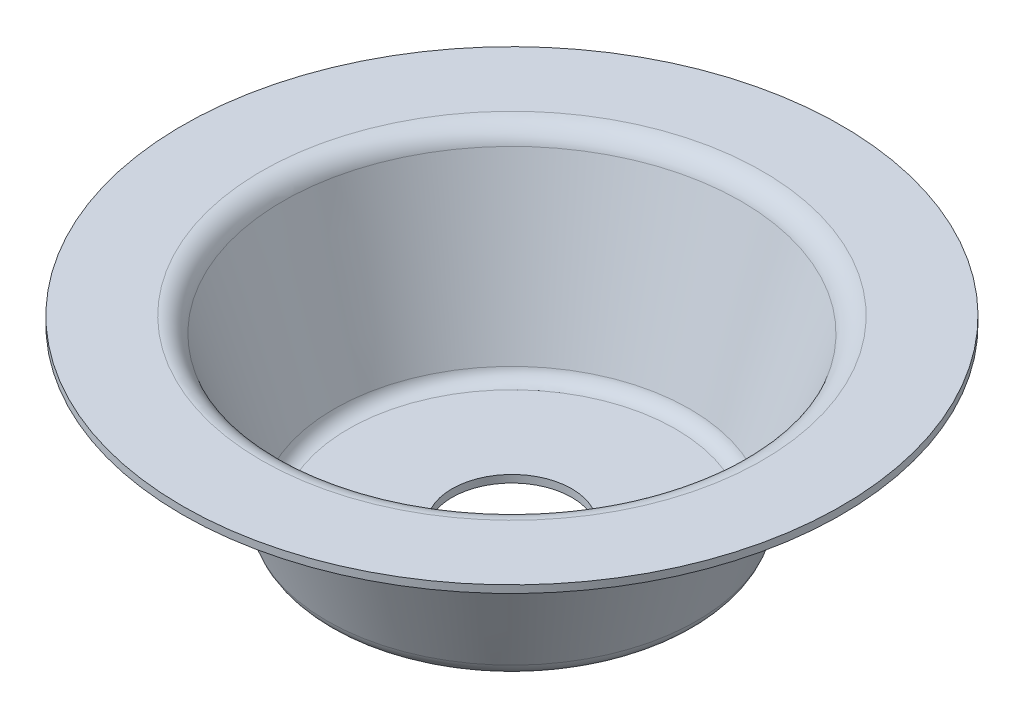
ISO-10303-21;
HEADER;
FILE_DESCRIPTION(('STEP AP214'),'2;1');
FILE_NAME('part.step','',(''),(''),'','','');
FILE_SCHEMA(('AUTOMOTIVE_DESIGN { 1 0 10303 214 1 1 1 1 }'));
ENDSEC;
DATA;
#1=APPLICATION_CONTEXT('core data for automotive mechanical design processes');
#2=APPLICATION_PROTOCOL_DEFINITION('international standard','automotive_design',2000,#1);
#3=PRODUCT_CONTEXT('',#1,'mechanical');
#4=PRODUCT('Part','Part','',(#3));
#5=PRODUCT_RELATED_PRODUCT_CATEGORY('part','',(#4));
#6=PRODUCT_DEFINITION_FORMATION('','',#4);
#7=PRODUCT_DEFINITION_CONTEXT('part definition',#1,'design');
#8=PRODUCT_DEFINITION('design','',#6,#7);
#9=PRODUCT_DEFINITION_SHAPE('','',#8);
#10=(LENGTH_UNIT() NAMED_UNIT(*) SI_UNIT(.MILLI.,.METRE.));
#11=(NAMED_UNIT(*) PLANE_ANGLE_UNIT() SI_UNIT($,.RADIAN.));
#12=(NAMED_UNIT(*) SI_UNIT($,.STERADIAN.) SOLID_ANGLE_UNIT());
#13=UNCERTAINTY_MEASURE_WITH_UNIT(LENGTH_MEASURE(1.E-05),#10,'distance_accuracy_value','');
#14=(GEOMETRIC_REPRESENTATION_CONTEXT(3) GLOBAL_UNCERTAINTY_ASSIGNED_CONTEXT((#13)) GLOBAL_UNIT_ASSIGNED_CONTEXT((#10,
#11,#12)) REPRESENTATION_CONTEXT('',''));
#15=CARTESIAN_POINT('',(0.,0.,0.));
#16=DIRECTION('',(0.,0.,1.));
#17=DIRECTION('',(1.,0.,0.));
#18=AXIS2_PLACEMENT_3D('',#15,#16,#17);
#19=CARTESIAN_POINT('',(-53.0884105236782,39.6875,0.));
#20=DIRECTION('',(0.,1.,0.));
#21=DIRECTION('',(0.,0.,1.));
#22=AXIS2_PLACEMENT_3D('',#19,#20,#21);
#23=PLANE('',#22);
#24=CARTESIAN_POINT('',(0.,39.6875,0.));
#25=DIRECTION('',(0.,1.,0.));
#26=DIRECTION('',(0.,0.,1.));
#27=AXIS2_PLACEMENT_3D('',#24,#25,#26);
#28=CIRCLE('',#27,69.85);
#29=CARTESIAN_POINT('',(0.,39.6875,69.85));
#30=VERTEX_POINT('',#29);
#31=EDGE_CURVE('E10',#30,#30,#28,.T.);
#32=ORIENTED_EDGE('',*,*,#31,.T.);
#33=EDGE_LOOP('',(#32));
#34=FACE_BOUND('',#33,.T.);
#35=CARTESIAN_POINT('',(0.,39.6875,0.));
#36=DIRECTION('',(0.,1.,0.));
#37=DIRECTION('',(0.,0.,1.));
#38=AXIS2_PLACEMENT_3D('',#35,#36,#37);
#39=CIRCLE('',#38,53.0884105236782);
#40=CARTESIAN_POINT('',(0.,39.6875,53.0884105236782));
#41=VERTEX_POINT('',#40);
#42=EDGE_CURVE('E66',#41,#41,#39,.T.);
#43=ORIENTED_EDGE('',*,*,#42,.F.);
#44=EDGE_LOOP('',(#43));
#45=FACE_BOUND('',#44,.T.);
#46=ADVANCED_FACE('F32',(#34,#45),#23,.T.);
#47=CARTESIAN_POINT('',(0.,40.5012674271229,0.));
#48=DIRECTION('',(0.,1.,0.));
#49=DIRECTION('',(0.,0.,1.));
#50=AXIS2_PLACEMENT_3D('',#47,#48,#49);
#51=CYLINDRICAL_SURFACE('',#50,69.85);
#52=ORIENTED_EDGE('',*,*,#31,.F.);
#53=EDGE_LOOP('',(#52));
#54=FACE_BOUND('',#53,.T.);
#55=CARTESIAN_POINT('',(0.,38.1,0.));
#56=DIRECTION('',(0.,1.,0.));
#57=DIRECTION('',(0.,0.,1.));
#58=AXIS2_PLACEMENT_3D('',#55,#56,#57);
#59=CIRCLE('',#58,69.85);
#60=CARTESIAN_POINT('',(0.,38.1,69.85));
#61=VERTEX_POINT('',#60);
#62=EDGE_CURVE('E39',#61,#61,#59,.T.);
#63=ORIENTED_EDGE('',*,*,#62,.T.);
#64=EDGE_LOOP('',(#63));
#65=FACE_BOUND('',#64,.T.);
#66=ADVANCED_FACE('F97',(#54,#65),#51,.T.);
#67=CARTESIAN_POINT('',(-53.0884105236782,38.1,0.));
#68=DIRECTION('',(0.,1.,0.));
#69=DIRECTION('',(0.,0.,1.));
#70=AXIS2_PLACEMENT_3D('',#67,#68,#69);
#71=PLANE('',#70);
#72=ORIENTED_EDGE('',*,*,#62,.F.);
#73=EDGE_LOOP('',(#72));
#74=FACE_BOUND('',#73,.T.);
#75=CARTESIAN_POINT('',(0.,38.1,0.));
#76=DIRECTION('',(0.,1.,0.));
#77=DIRECTION('',(0.,0.,1.));
#78=AXIS2_PLACEMENT_3D('',#75,#76,#77);
#79=CIRCLE('',#78,53.0884105236782);
#80=CARTESIAN_POINT('',(0.,38.1,53.0884105236782));
#81=VERTEX_POINT('',#80);
#82=EDGE_CURVE('E43',#81,#81,#79,.T.);
#83=ORIENTED_EDGE('',*,*,#82,.T.);
#84=EDGE_LOOP('',(#83));
#85=FACE_BOUND('',#84,.T.);
#86=ADVANCED_FACE('F101',(#74,#85),#71,.F.);
#87=CARTESIAN_POINT('',(0.,34.925,0.));
#88=DIRECTION('',(0.,1.,0.));
#89=DIRECTION('',(0.,0.,1.));
#90=AXIS2_PLACEMENT_3D('',#87,#88,#89);
#91=TOROIDAL_SURFACE('',#90,53.0884105236782,3.175);
#92=ORIENTED_EDGE('',*,*,#82,.F.);
#93=EDGE_LOOP('',(#92));
#94=FACE_BOUND('',#93,.T.);
#95=CARTESIAN_POINT('',(0.,35.9290231571034,0.));
#96=DIRECTION('',(0.,1.,0.));
#97=DIRECTION('',(0.,0.,1.));
#98=AXIS2_PLACEMENT_3D('',#95,#96,#97);
#99=CIRCLE('',#98,50.0763410523678);
#100=CARTESIAN_POINT('',(0.,35.9290231571034,50.0763410523678));
#101=VERTEX_POINT('',#100);
#102=EDGE_CURVE('E48',#101,#101,#99,.T.);
#103=ORIENTED_EDGE('',*,*,#102,.T.);
#104=EDGE_LOOP('',(#103));
#105=FACE_BOUND('',#104,.T.);
#106=ADVANCED_FACE('F167',(#94,#105),#91,.F.);
#107=CARTESIAN_POINT('',(0.,3.2564652643448,0.));
#108=DIRECTION('',(0.,1.,0.));
#109=DIRECTION('',(0.,0.,1.));
#110=AXIS2_PLACEMENT_3D('',#107,#108,#109);
#111=CONICAL_SURFACE('',#110,39.1854884214483,0.321750554396642);
#112=ORIENTED_EDGE('',*,*,#102,.F.);
#113=EDGE_LOOP('',(#112));
#114=FACE_BOUND('',#113,.T.);
#115=CARTESIAN_POINT('',(0.,3.2564652643448,0.));
#116=DIRECTION('',(0.,1.,0.));
#117=DIRECTION('',(0.,0.,1.));
#118=AXIS2_PLACEMENT_3D('',#115,#116,#117);
#119=CIRCLE('',#118,39.1854884214483);
#120=CARTESIAN_POINT('',(0.,3.2564652643448,39.1854884214483));
#121=VERTEX_POINT('',#120);
#122=EDGE_CURVE('E51',#121,#121,#119,.T.);
#123=ORIENTED_EDGE('',*,*,#122,.T.);
#124=EDGE_LOOP('',(#123));
#125=FACE_BOUND('',#124,.T.);
#126=ADVANCED_FACE('F157',(#114,#125),#111,.T.);
#127=CARTESIAN_POINT('',(0.,4.7625,0.));
#128=DIRECTION('',(0.,1.,0.));
#129=DIRECTION('',(0.,0.,1.));
#130=AXIS2_PLACEMENT_3D('',#127,#128,#129);
#131=TOROIDAL_SURFACE('',#130,34.6673842144827,4.7625);
#132=ORIENTED_EDGE('',*,*,#122,.F.);
#133=EDGE_LOOP('',(#132));
#134=FACE_BOUND('',#133,.T.);
#135=CARTESIAN_POINT('',(0.,0.,0.));
#136=DIRECTION('',(0.,1.,0.));
#137=DIRECTION('',(0.,0.,1.));
#138=AXIS2_PLACEMENT_3D('',#135,#136,#137);
#139=CIRCLE('',#138,34.6673842144827);
#140=CARTESIAN_POINT('',(0.,0.,34.6673842144827));
#141=VERTEX_POINT('',#140);
#142=EDGE_CURVE('E54',#141,#141,#139,.T.);
#143=ORIENTED_EDGE('',*,*,#142,.T.);
#144=EDGE_LOOP('',(#143));
#145=FACE_BOUND('',#144,.T.);
#146=ADVANCED_FACE('F134',(#134,#145),#131,.T.);
#147=CARTESIAN_POINT('',(0.,0.,0.));
#148=DIRECTION('',(0.,1.,0.));
#149=DIRECTION('',(0.,0.,1.));
#150=AXIS2_PLACEMENT_3D('',#147,#148,#149);
#151=PLANE('',#150);
#152=CARTESIAN_POINT('',(0.,0.,0.));
#153=DIRECTION('',(0.,-1.,0.));
#154=DIRECTION('',(0.,0.,-1.));
#155=AXIS2_PLACEMENT_3D('',#152,#153,#154);
#156=CIRCLE('',#155,12.7);
#157=CARTESIAN_POINT('',(0.,0.,-12.7));
#158=VERTEX_POINT('',#157);
#159=EDGE_CURVE('E69',#158,#158,#156,.T.);
#160=ORIENTED_EDGE('',*,*,#159,.F.);
#161=EDGE_LOOP('',(#160));
#162=FACE_BOUND('',#161,.T.);
#163=ORIENTED_EDGE('',*,*,#142,.F.);
#164=EDGE_LOOP('',(#163));
#165=FACE_BOUND('',#164,.T.);
#166=ADVANCED_FACE('F82',(#162,#165),#151,.F.);
#167=CARTESIAN_POINT('',(0.,1.5875,0.));
#168=DIRECTION('',(0.,1.,0.));
#169=DIRECTION('',(0.,0.,1.));
#170=AXIS2_PLACEMENT_3D('',#167,#168,#169);
#171=PLANE('',#170);
#172=CARTESIAN_POINT('',(0.,1.5875,0.));
#173=DIRECTION('',(0.,1.,0.));
#174=DIRECTION('',(0.,0.,1.));
#175=AXIS2_PLACEMENT_3D('',#172,#173,#174);
#176=CIRCLE('',#175,12.7);
#177=CARTESIAN_POINT('',(0.,1.5875,12.7));
#178=VERTEX_POINT('',#177);
#179=EDGE_CURVE('E35',#178,#178,#176,.T.);
#180=ORIENTED_EDGE('',*,*,#179,.F.);
#181=EDGE_LOOP('',(#180));
#182=FACE_BOUND('',#181,.T.);
#183=CARTESIAN_POINT('',(0.,1.5875,0.));
#184=DIRECTION('',(0.,1.,0.));
#185=DIRECTION('',(0.,0.,1.));
#186=AXIS2_PLACEMENT_3D('',#183,#184,#185);
#187=CIRCLE('',#186,34.6673842144827);
#188=CARTESIAN_POINT('',(0.,1.5875,34.6673842144827));
#189=VERTEX_POINT('',#188);
#190=EDGE_CURVE('E57',#189,#189,#187,.T.);
#191=ORIENTED_EDGE('',*,*,#190,.T.);
#192=EDGE_LOOP('',(#191));
#193=FACE_BOUND('',#192,.T.);
#194=ADVANCED_FACE('F78',(#182,#193),#171,.T.);
#195=CARTESIAN_POINT('',(0.,4.7625,0.));
#196=DIRECTION('',(0.,1.,0.));
#197=DIRECTION('',(0.,0.,1.));
#198=AXIS2_PLACEMENT_3D('',#195,#196,#197);
#199=TOROIDAL_SURFACE('',#198,34.6673842144827,3.175);
#200=CARTESIAN_POINT('',(0.,3.75847684289653,0.));
#201=DIRECTION('',(0.,1.,0.));
#202=DIRECTION('',(0.,0.,1.));
#203=AXIS2_PLACEMENT_3D('',#200,#201,#202);
#204=CIRCLE('',#203,37.6794536857931);
#205=CARTESIAN_POINT('',(0.,3.75847684289653,37.6794536857931));
#206=VERTEX_POINT('',#205);
#207=EDGE_CURVE('E60',#206,#206,#204,.T.);
#208=ORIENTED_EDGE('',*,*,#207,.T.);
#209=EDGE_LOOP('',(#208));
#210=FACE_BOUND('',#209,.T.);
#211=ORIENTED_EDGE('',*,*,#190,.F.);
#212=EDGE_LOOP('',(#211));
#213=FACE_BOUND('',#212,.T.);
#214=ADVANCED_FACE('F81',(#210,#213),#199,.F.);
#215=CARTESIAN_POINT('',(0.,3.75847684289653,0.));
#216=DIRECTION('',(0.,1.,0.));
#217=DIRECTION('',(0.,0.,1.));
#218=AXIS2_PLACEMENT_3D('',#215,#216,#217);
#219=CONICAL_SURFACE('',#218,37.6794536857931,0.321750554396642);
#220=CARTESIAN_POINT('',(0.,36.4310347356552,0.));
#221=DIRECTION('',(0.,1.,0.));
#222=DIRECTION('',(0.,0.,1.));
#223=AXIS2_PLACEMENT_3D('',#220,#221,#222);
#224=CIRCLE('',#223,48.5703063167126);
#225=CARTESIAN_POINT('',(0.,36.4310347356552,48.5703063167126));
#226=VERTEX_POINT('',#225);
#227=EDGE_CURVE('E63',#226,#226,#224,.T.);
#228=ORIENTED_EDGE('',*,*,#227,.T.);
#229=EDGE_LOOP('',(#228));
#230=FACE_BOUND('',#229,.T.);
#231=ORIENTED_EDGE('',*,*,#207,.F.);
#232=EDGE_LOOP('',(#231));
#233=FACE_BOUND('',#232,.T.);
#234=ADVANCED_FACE('F87',(#230,#233),#219,.F.);
#235=CARTESIAN_POINT('',(0.,34.925,0.));
#236=DIRECTION('',(0.,1.,0.));
#237=DIRECTION('',(0.,0.,1.));
#238=AXIS2_PLACEMENT_3D('',#235,#236,#237);
#239=TOROIDAL_SURFACE('',#238,53.0884105236782,4.7625);
#240=ORIENTED_EDGE('',*,*,#42,.T.);
#241=EDGE_LOOP('',(#240));
#242=FACE_BOUND('',#241,.T.);
#243=ORIENTED_EDGE('',*,*,#227,.F.);
#244=EDGE_LOOP('',(#243));
#245=FACE_BOUND('',#244,.T.);
#246=ADVANCED_FACE('F93',(#242,#245),#239,.T.);
#247=CARTESIAN_POINT('',(0.,39.6875,0.));
#248=DIRECTION('',(0.,-1.,0.));
#249=DIRECTION('',(0.,0.,-1.));
#250=AXIS2_PLACEMENT_3D('',#247,#248,#249);
#251=CYLINDRICAL_SURFACE('',#250,12.7);
#252=ORIENTED_EDGE('',*,*,#179,.T.);
#253=EDGE_LOOP('',(#252));
#254=FACE_BOUND('',#253,.T.);
#255=ORIENTED_EDGE('',*,*,#159,.T.);
#256=EDGE_LOOP('',(#255));
#257=FACE_BOUND('',#256,.T.);
#258=ADVANCED_FACE('F76',(#254,#257),#251,.F.);
#259=CLOSED_SHELL('',(#46,#66,#86,#106,#126,#146,#166,#194,#214,#234,#246,#258));
#260=MANIFOLD_SOLID_BREP('B2',#259);
#261=ADVANCED_BREP_SHAPE_REPRESENTATION('',(#18,#260),#14);
#262=SHAPE_DEFINITION_REPRESENTATION(#9,#261);
ENDSEC;
END-ISO-10303-21;
